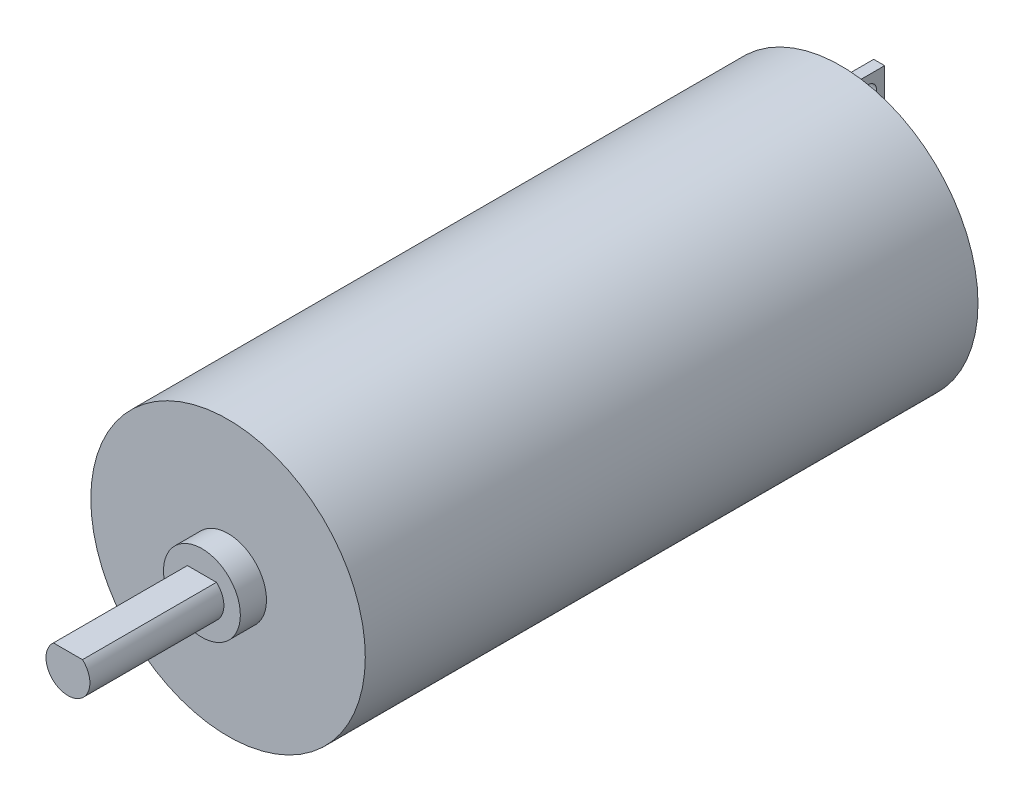
ISO-10303-21;
HEADER;
FILE_DESCRIPTION(('STEP AP214'),'2;1');
FILE_NAME('part.step','',(''),(''),'','','');
FILE_SCHEMA(('AUTOMOTIVE_DESIGN { 1 0 10303 214 1 1 1 1 }'));
ENDSEC;
DATA;
#1=APPLICATION_CONTEXT('core data for automotive mechanical design processes');
#2=APPLICATION_PROTOCOL_DEFINITION('international standard','automotive_design',2000,#1);
#3=PRODUCT_CONTEXT('',#1,'mechanical');
#4=PRODUCT('Part','Part','',(#3));
#5=PRODUCT_RELATED_PRODUCT_CATEGORY('part','',(#4));
#6=PRODUCT_DEFINITION_FORMATION('','',#4);
#7=PRODUCT_DEFINITION_CONTEXT('part definition',#1,'design');
#8=PRODUCT_DEFINITION('design','',#6,#7);
#9=PRODUCT_DEFINITION_SHAPE('','',#8);
#10=(LENGTH_UNIT() NAMED_UNIT(*) SI_UNIT(.MILLI.,.METRE.));
#11=(NAMED_UNIT(*) PLANE_ANGLE_UNIT() SI_UNIT($,.RADIAN.));
#12=(NAMED_UNIT(*) SI_UNIT($,.STERADIAN.) SOLID_ANGLE_UNIT());
#13=UNCERTAINTY_MEASURE_WITH_UNIT(LENGTH_MEASURE(1.E-05),#10,'distance_accuracy_value','');
#14=(GEOMETRIC_REPRESENTATION_CONTEXT(3) GLOBAL_UNCERTAINTY_ASSIGNED_CONTEXT((#13)) GLOBAL_UNIT_ASSIGNED_CONTEXT((#10,
#11,#12)) REPRESENTATION_CONTEXT('',''));
#15=CARTESIAN_POINT('',(0.,0.,0.));
#16=DIRECTION('',(0.,0.,1.));
#17=DIRECTION('',(1.,0.,0.));
#18=AXIS2_PLACEMENT_3D('',#15,#16,#17);
#19=CARTESIAN_POINT('',(0.,0.,70.38));
#20=DIRECTION('',(0.,0.,-1.));
#21=DIRECTION('',(-1.,0.,0.));
#22=AXIS2_PLACEMENT_3D('',#19,#20,#21);
#23=CYLINDRICAL_SURFACE('',#22,2.);
#24=DIRECTION('',(0.,0.,-1.));
#25=VECTOR('',#24,1.);
#26=CARTESIAN_POINT('',(-1.3228756555323,1.5,70.38));
#27=LINE('',#26,#25);
#28=CARTESIAN_POINT('',(-1.3228756555323,1.5,70.38));
#29=VERTEX_POINT('',#28);
#30=CARTESIAN_POINT('',(-1.3228756555323,1.5,58.18));
#31=VERTEX_POINT('',#30);
#32=EDGE_CURVE('E223',#29,#31,#27,.T.);
#33=ORIENTED_EDGE('',*,*,#32,.T.);
#34=CARTESIAN_POINT('',(0.,0.,58.18));
#35=DIRECTION('',(0.,0.,1.));
#36=DIRECTION('',(1.,0.,0.));
#37=AXIS2_PLACEMENT_3D('',#34,#35,#36);
#38=CIRCLE('',#37,2.);
#39=CARTESIAN_POINT('',(1.3228756555323,1.5,58.18));
#40=VERTEX_POINT('',#39);
#41=EDGE_CURVE('E11',#31,#40,#38,.T.);
#42=ORIENTED_EDGE('',*,*,#41,.T.);
#43=DIRECTION('',(0.,0.,-1.));
#44=VECTOR('',#43,1.);
#45=CARTESIAN_POINT('',(1.3228756555323,1.5,70.38));
#46=LINE('',#45,#44);
#47=CARTESIAN_POINT('',(1.3228756555323,1.5,70.38));
#48=VERTEX_POINT('',#47);
#49=EDGE_CURVE('E217',#48,#40,#46,.T.);
#50=ORIENTED_EDGE('',*,*,#49,.F.);
#51=CARTESIAN_POINT('',(0.,0.,70.38));
#52=DIRECTION('',(0.,0.,1.));
#53=DIRECTION('',(1.,0.,0.));
#54=AXIS2_PLACEMENT_3D('',#51,#52,#53);
#55=CIRCLE('',#54,2.);
#56=EDGE_CURVE('E227',#29,#48,#55,.T.);
#57=ORIENTED_EDGE('',*,*,#56,.F.);
#58=EDGE_LOOP('',(#33,#42,#50,#57));
#59=FACE_BOUND('',#58,.T.);
#60=ADVANCED_FACE('F44',(#59),#23,.T.);
#61=CARTESIAN_POINT('',(0.,0.,70.38));
#62=DIRECTION('',(0.,0.,1.));
#63=DIRECTION('',(1.,0.,0.));
#64=AXIS2_PLACEMENT_3D('',#61,#62,#63);
#65=PLANE('',#64);
#66=ORIENTED_EDGE('',*,*,#56,.T.);
#67=DIRECTION('',(1.,0.,0.));
#68=VECTOR('',#67,1.);
#69=CARTESIAN_POINT('',(-1.3228756555323,1.5,70.38));
#70=LINE('',#69,#68);
#71=EDGE_CURVE('E214',#29,#48,#70,.T.);
#72=ORIENTED_EDGE('',*,*,#71,.F.);
#73=EDGE_LOOP('',(#66,#72));
#74=FACE_BOUND('',#73,.T.);
#75=ADVANCED_FACE('F286',(#74),#65,.T.);
#76=CARTESIAN_POINT('',(0.,0.,55.8));
#77=DIRECTION('',(0.,0.,-1.));
#78=DIRECTION('',(-1.,0.,0.));
#79=AXIS2_PLACEMENT_3D('',#76,#77,#78);
#80=CYLINDRICAL_SURFACE('',#79,12.5);
#81=CARTESIAN_POINT('',(0.,0.,55.8));
#82=DIRECTION('',(0.,0.,1.));
#83=DIRECTION('',(1.,0.,0.));
#84=AXIS2_PLACEMENT_3D('',#81,#82,#83);
#85=CIRCLE('',#84,12.5);
#86=CARTESIAN_POINT('',(12.5,0.,55.8));
#87=VERTEX_POINT('',#86);
#88=EDGE_CURVE('E239',#87,#87,#85,.T.);
#89=ORIENTED_EDGE('',*,*,#88,.F.);
#90=EDGE_LOOP('',(#89));
#91=FACE_BOUND('',#90,.T.);
#92=CARTESIAN_POINT('',(0.,0.,0.));
#93=DIRECTION('',(0.,0.,1.));
#94=DIRECTION('',(1.,0.,0.));
#95=AXIS2_PLACEMENT_3D('',#92,#93,#94);
#96=CIRCLE('',#95,12.5);
#97=CARTESIAN_POINT('',(12.5,0.,0.));
#98=VERTEX_POINT('',#97);
#99=EDGE_CURVE('E235',#98,#98,#96,.T.);
#100=ORIENTED_EDGE('',*,*,#99,.T.);
#101=EDGE_LOOP('',(#100));
#102=FACE_BOUND('',#101,.T.);
#103=ADVANCED_FACE('F46',(#91,#102),#80,.T.);
#104=CARTESIAN_POINT('',(0.,0.,55.8));
#105=DIRECTION('',(0.,0.,1.));
#106=DIRECTION('',(1.,0.,0.));
#107=AXIS2_PLACEMENT_3D('',#104,#105,#106);
#108=PLANE('',#107);
#109=CARTESIAN_POINT('',(0.,0.,55.8));
#110=DIRECTION('',(0.,0.,1.));
#111=DIRECTION('',(1.,0.,0.));
#112=AXIS2_PLACEMENT_3D('',#109,#110,#111);
#113=CIRCLE('',#112,3.5);
#114=CARTESIAN_POINT('',(3.5,0.,55.8));
#115=VERTEX_POINT('',#114);
#116=EDGE_CURVE('E54',#115,#115,#113,.T.);
#117=ORIENTED_EDGE('',*,*,#116,.F.);
#118=EDGE_LOOP('',(#117));
#119=FACE_BOUND('',#118,.T.);
#120=ORIENTED_EDGE('',*,*,#88,.T.);
#121=EDGE_LOOP('',(#120));
#122=FACE_BOUND('',#121,.T.);
#123=ADVANCED_FACE('F305',(#119,#122),#108,.T.);
#124=CARTESIAN_POINT('',(0.,0.,0.));
#125=DIRECTION('',(0.,0.,1.));
#126=DIRECTION('',(1.,0.,0.));
#127=AXIS2_PLACEMENT_3D('',#124,#125,#126);
#128=PLANE('',#127);
#129=DIRECTION('',(-1.,0.,0.));
#130=VECTOR('',#129,1.);
#131=CARTESIAN_POINT('',(-0.5,-8.,0.));
#132=LINE('',#131,#130);
#133=CARTESIAN_POINT('',(0.5,-8.,0.));
#134=VERTEX_POINT('',#133);
#135=CARTESIAN_POINT('',(-0.5,-8.,0.));
#136=VERTEX_POINT('',#135);
#137=EDGE_CURVE('E128',#134,#136,#132,.T.);
#138=ORIENTED_EDGE('',*,*,#137,.T.);
#139=DIRECTION('',(0.,-1.,0.));
#140=VECTOR('',#139,1.);
#141=CARTESIAN_POINT('',(-0.5,-8.,0.));
#142=LINE('',#141,#140);
#143=CARTESIAN_POINT('',(-0.5,-11.,0.));
#144=VERTEX_POINT('',#143);
#145=EDGE_CURVE('E139',#136,#144,#142,.T.);
#146=ORIENTED_EDGE('',*,*,#145,.T.);
#147=DIRECTION('',(1.,0.,0.));
#148=VECTOR('',#147,1.);
#149=CARTESIAN_POINT('',(-0.5,-11.,0.));
#150=LINE('',#149,#148);
#151=CARTESIAN_POINT('',(0.5,-11.,0.));
#152=VERTEX_POINT('',#151);
#153=EDGE_CURVE('E147',#144,#152,#150,.T.);
#154=ORIENTED_EDGE('',*,*,#153,.T.);
#155=DIRECTION('',(0.,1.,0.));
#156=VECTOR('',#155,1.);
#157=CARTESIAN_POINT('',(0.5,-8.,0.));
#158=LINE('',#157,#156);
#159=EDGE_CURVE('E62',#152,#134,#158,.T.);
#160=ORIENTED_EDGE('',*,*,#159,.T.);
#161=EDGE_LOOP('',(#138,#146,#154,#160));
#162=FACE_BOUND('',#161,.T.);
#163=DIRECTION('',(-1.,0.,0.));
#164=VECTOR('',#163,1.);
#165=CARTESIAN_POINT('',(-0.5,11.,0.));
#166=LINE('',#165,#164);
#167=CARTESIAN_POINT('',(0.5,11.,0.));
#168=VERTEX_POINT('',#167);
#169=CARTESIAN_POINT('',(-0.5,11.,0.));
#170=VERTEX_POINT('',#169);
#171=EDGE_CURVE('E177',#168,#170,#166,.T.);
#172=ORIENTED_EDGE('',*,*,#171,.T.);
#173=DIRECTION('',(0.,-1.,0.));
#174=VECTOR('',#173,1.);
#175=CARTESIAN_POINT('',(-0.5,11.,0.));
#176=LINE('',#175,#174);
#177=CARTESIAN_POINT('',(-0.5,8.,0.));
#178=VERTEX_POINT('',#177);
#179=EDGE_CURVE('E146',#170,#178,#176,.T.);
#180=ORIENTED_EDGE('',*,*,#179,.T.);
#181=DIRECTION('',(1.,0.,0.));
#182=VECTOR('',#181,1.);
#183=CARTESIAN_POINT('',(-0.5,8.,0.));
#184=LINE('',#183,#182);
#185=CARTESIAN_POINT('',(0.5,8.,0.));
#186=VERTEX_POINT('',#185);
#187=EDGE_CURVE('E193',#178,#186,#184,.T.);
#188=ORIENTED_EDGE('',*,*,#187,.T.);
#189=DIRECTION('',(0.,1.,0.));
#190=VECTOR('',#189,1.);
#191=CARTESIAN_POINT('',(0.5,11.,0.));
#192=LINE('',#191,#190);
#193=EDGE_CURVE('E70',#186,#168,#192,.T.);
#194=ORIENTED_EDGE('',*,*,#193,.T.);
#195=EDGE_LOOP('',(#172,#180,#188,#194));
#196=FACE_BOUND('',#195,.T.);
#197=ORIENTED_EDGE('',*,*,#99,.F.);
#198=EDGE_LOOP('',(#197));
#199=FACE_BOUND('',#198,.T.);
#200=ADVANCED_FACE('F149',(#162,#196,#199),#128,.F.);
#201=CARTESIAN_POINT('',(0.,0.,58.18));
#202=DIRECTION('',(0.,0.,-1.));
#203=DIRECTION('',(-1.,0.,0.));
#204=AXIS2_PLACEMENT_3D('',#201,#202,#203);
#205=CYLINDRICAL_SURFACE('',#204,3.5);
#206=CARTESIAN_POINT('',(0.,0.,58.18));
#207=DIRECTION('',(0.,0.,1.));
#208=DIRECTION('',(1.,0.,0.));
#209=AXIS2_PLACEMENT_3D('',#206,#207,#208);
#210=CIRCLE('',#209,3.5);
#211=CARTESIAN_POINT('',(3.5,0.,58.18));
#212=VERTEX_POINT('',#211);
#213=EDGE_CURVE('E230',#212,#212,#210,.T.);
#214=ORIENTED_EDGE('',*,*,#213,.F.);
#215=EDGE_LOOP('',(#214));
#216=FACE_BOUND('',#215,.T.);
#217=ORIENTED_EDGE('',*,*,#116,.T.);
#218=EDGE_LOOP('',(#217));
#219=FACE_BOUND('',#218,.T.);
#220=ADVANCED_FACE('F300',(#216,#219),#205,.T.);
#221=CARTESIAN_POINT('',(0.,0.,58.18));
#222=DIRECTION('',(0.,0.,1.));
#223=DIRECTION('',(1.,0.,0.));
#224=AXIS2_PLACEMENT_3D('',#221,#222,#223);
#225=PLANE('',#224);
#226=DIRECTION('',(1.,0.,0.));
#227=VECTOR('',#226,1.);
#228=CARTESIAN_POINT('',(-1.3228756555323,1.5,58.18));
#229=LINE('',#228,#227);
#230=EDGE_CURVE('E205',#31,#40,#229,.T.);
#231=ORIENTED_EDGE('',*,*,#230,.T.);
#232=ORIENTED_EDGE('',*,*,#41,.F.);
#233=EDGE_LOOP('',(#231,#232));
#234=FACE_BOUND('',#233,.T.);
#235=ORIENTED_EDGE('',*,*,#213,.T.);
#236=EDGE_LOOP('',(#235));
#237=FACE_BOUND('',#236,.T.);
#238=ADVANCED_FACE('F296',(#234,#237),#225,.T.);
#239=CARTESIAN_POINT('',(-1.3228756555323,1.5,70.38));
#240=DIRECTION('',(0.,1.,0.));
#241=DIRECTION('',(0.,0.,1.));
#242=AXIS2_PLACEMENT_3D('',#239,#240,#241);
#243=PLANE('',#242);
#244=ORIENTED_EDGE('',*,*,#230,.F.);
#245=ORIENTED_EDGE('',*,*,#32,.F.);
#246=ORIENTED_EDGE('',*,*,#71,.T.);
#247=ORIENTED_EDGE('',*,*,#49,.T.);
#248=EDGE_LOOP('',(#244,#245,#246,#247));
#249=FACE_BOUND('',#248,.T.);
#250=ADVANCED_FACE('F299',(#249),#243,.T.);
#251=CARTESIAN_POINT('',(-0.5,11.,-3.5));
#252=DIRECTION('',(-1.,0.,0.));
#253=DIRECTION('',(0.,-1.,0.));
#254=AXIS2_PLACEMENT_3D('',#251,#252,#253);
#255=PLANE('',#254);
#256=CARTESIAN_POINT('',(-0.5,9.5,-2.));
#257=DIRECTION('',(-1.,0.,0.));
#258=DIRECTION('',(0.,-1.,0.));
#259=AXIS2_PLACEMENT_3D('',#256,#257,#258);
#260=CIRCLE('',#259,0.75);
#261=CARTESIAN_POINT('',(-0.5,8.75,-2.));
#262=VERTEX_POINT('',#261);
#263=EDGE_CURVE('E136',#262,#262,#260,.T.);
#264=ORIENTED_EDGE('',*,*,#263,.F.);
#265=EDGE_LOOP('',(#264));
#266=FACE_BOUND('',#265,.T.);
#267=ORIENTED_EDGE('',*,*,#179,.F.);
#268=DIRECTION('',(0.,0.,1.));
#269=VECTOR('',#268,1.);
#270=CARTESIAN_POINT('',(-0.5,11.,-3.5));
#271=LINE('',#270,#269);
#272=CARTESIAN_POINT('',(-0.5,11.,-3.5));
#273=VERTEX_POINT('',#272);
#274=EDGE_CURVE('E202',#273,#170,#271,.T.);
#275=ORIENTED_EDGE('',*,*,#274,.F.);
#276=DIRECTION('',(0.,-1.,0.));
#277=VECTOR('',#276,1.);
#278=CARTESIAN_POINT('',(-0.5,11.,-3.5));
#279=LINE('',#278,#277);
#280=CARTESIAN_POINT('',(-0.5,8.,-3.5));
#281=VERTEX_POINT('',#280);
#282=EDGE_CURVE('E172',#273,#281,#279,.T.);
#283=ORIENTED_EDGE('',*,*,#282,.T.);
#284=DIRECTION('',(0.,0.,1.));
#285=VECTOR('',#284,1.);
#286=CARTESIAN_POINT('',(-0.5,8.,-3.5));
#287=LINE('',#286,#285);
#288=EDGE_CURVE('E189',#281,#178,#287,.T.);
#289=ORIENTED_EDGE('',*,*,#288,.T.);
#290=EDGE_LOOP('',(#267,#275,#283,#289));
#291=FACE_BOUND('',#290,.T.);
#292=ADVANCED_FACE('F330',(#266,#291),#255,.T.);
#293=CARTESIAN_POINT('',(-0.5,11.,-3.5));
#294=DIRECTION('',(0.,1.,0.));
#295=DIRECTION('',(0.,0.,1.));
#296=AXIS2_PLACEMENT_3D('',#293,#294,#295);
#297=PLANE('',#296);
#298=ORIENTED_EDGE('',*,*,#171,.F.);
#299=DIRECTION('',(0.,0.,1.));
#300=VECTOR('',#299,1.);
#301=CARTESIAN_POINT('',(0.5,11.,-3.5));
#302=LINE('',#301,#300);
#303=CARTESIAN_POINT('',(0.5,11.,-3.5));
#304=VERTEX_POINT('',#303);
#305=EDGE_CURVE('E206',#304,#168,#302,.T.);
#306=ORIENTED_EDGE('',*,*,#305,.F.);
#307=DIRECTION('',(-1.,0.,0.));
#308=VECTOR('',#307,1.);
#309=CARTESIAN_POINT('',(-0.5,11.,-3.5));
#310=LINE('',#309,#308);
#311=EDGE_CURVE('E185',#304,#273,#310,.T.);
#312=ORIENTED_EDGE('',*,*,#311,.T.);
#313=ORIENTED_EDGE('',*,*,#274,.T.);
#314=EDGE_LOOP('',(#298,#306,#312,#313));
#315=FACE_BOUND('',#314,.T.);
#316=ADVANCED_FACE('F337',(#315),#297,.T.);
#317=CARTESIAN_POINT('',(0.5,11.,-3.5));
#318=DIRECTION('',(1.,0.,0.));
#319=DIRECTION('',(0.,1.,0.));
#320=AXIS2_PLACEMENT_3D('',#317,#318,#319);
#321=PLANE('',#320);
#322=CARTESIAN_POINT('',(0.5,9.5,-2.));
#323=DIRECTION('',(1.,0.,0.));
#324=DIRECTION('',(0.,1.,0.));
#325=AXIS2_PLACEMENT_3D('',#322,#323,#324);
#326=CIRCLE('',#325,0.75);
#327=CARTESIAN_POINT('',(0.5,10.25,-2.));
#328=VERTEX_POINT('',#327);
#329=EDGE_CURVE('E48',#328,#328,#326,.T.);
#330=ORIENTED_EDGE('',*,*,#329,.F.);
#331=EDGE_LOOP('',(#330));
#332=FACE_BOUND('',#331,.T.);
#333=ORIENTED_EDGE('',*,*,#193,.F.);
#334=DIRECTION('',(0.,0.,1.));
#335=VECTOR('',#334,1.);
#336=CARTESIAN_POINT('',(0.5,8.,-3.5));
#337=LINE('',#336,#335);
#338=CARTESIAN_POINT('',(0.5,8.,-3.5));
#339=VERTEX_POINT('',#338);
#340=EDGE_CURVE('E209',#339,#186,#337,.T.);
#341=ORIENTED_EDGE('',*,*,#340,.F.);
#342=DIRECTION('',(0.,1.,0.));
#343=VECTOR('',#342,1.);
#344=CARTESIAN_POINT('',(0.5,11.,-3.5));
#345=LINE('',#344,#343);
#346=EDGE_CURVE('E181',#339,#304,#345,.T.);
#347=ORIENTED_EDGE('',*,*,#346,.T.);
#348=ORIENTED_EDGE('',*,*,#305,.T.);
#349=EDGE_LOOP('',(#333,#341,#347,#348));
#350=FACE_BOUND('',#349,.T.);
#351=ADVANCED_FACE('F346',(#332,#350),#321,.T.);
#352=CARTESIAN_POINT('',(-0.5,8.,-3.5));
#353=DIRECTION('',(0.,-1.,0.));
#354=DIRECTION('',(0.,0.,-1.));
#355=AXIS2_PLACEMENT_3D('',#352,#353,#354);
#356=PLANE('',#355);
#357=ORIENTED_EDGE('',*,*,#187,.F.);
#358=ORIENTED_EDGE('',*,*,#288,.F.);
#359=DIRECTION('',(1.,0.,0.));
#360=VECTOR('',#359,1.);
#361=CARTESIAN_POINT('',(-0.5,8.,-3.5));
#362=LINE('',#361,#360);
#363=EDGE_CURVE('E176',#281,#339,#362,.T.);
#364=ORIENTED_EDGE('',*,*,#363,.T.);
#365=ORIENTED_EDGE('',*,*,#340,.T.);
#366=EDGE_LOOP('',(#357,#358,#364,#365));
#367=FACE_BOUND('',#366,.T.);
#368=ADVANCED_FACE('F354',(#367),#356,.T.);
#369=CARTESIAN_POINT('',(0.,0.,-3.5));
#370=DIRECTION('',(0.,0.,1.));
#371=DIRECTION('',(1.,0.,0.));
#372=AXIS2_PLACEMENT_3D('',#369,#370,#371);
#373=PLANE('',#372);
#374=ORIENTED_EDGE('',*,*,#282,.F.);
#375=ORIENTED_EDGE('',*,*,#311,.F.);
#376=ORIENTED_EDGE('',*,*,#346,.F.);
#377=ORIENTED_EDGE('',*,*,#363,.F.);
#378=EDGE_LOOP('',(#374,#375,#376,#377));
#379=FACE_BOUND('',#378,.T.);
#380=ADVANCED_FACE('F362',(#379),#373,.F.);
#381=CARTESIAN_POINT('',(-0.5,-8.,-3.5));
#382=DIRECTION('',(-1.,0.,0.));
#383=DIRECTION('',(0.,-1.,0.));
#384=AXIS2_PLACEMENT_3D('',#381,#382,#383);
#385=PLANE('',#384);
#386=CARTESIAN_POINT('',(-0.5,-9.5,-2.));
#387=DIRECTION('',(-1.,0.,0.));
#388=DIRECTION('',(0.,-1.,0.));
#389=AXIS2_PLACEMENT_3D('',#386,#387,#388);
#390=CIRCLE('',#389,0.75);
#391=CARTESIAN_POINT('',(-0.5,-10.25,-2.));
#392=VERTEX_POINT('',#391);
#393=EDGE_CURVE('E248',#392,#392,#390,.T.);
#394=ORIENTED_EDGE('',*,*,#393,.F.);
#395=EDGE_LOOP('',(#394));
#396=FACE_BOUND('',#395,.T.);
#397=ORIENTED_EDGE('',*,*,#145,.F.);
#398=DIRECTION('',(0.,0.,1.));
#399=VECTOR('',#398,1.);
#400=CARTESIAN_POINT('',(-0.5,-8.,-3.5));
#401=LINE('',#400,#399);
#402=CARTESIAN_POINT('',(-0.5,-8.,-3.5));
#403=VERTEX_POINT('',#402);
#404=EDGE_CURVE('E124',#403,#136,#401,.T.);
#405=ORIENTED_EDGE('',*,*,#404,.F.);
#406=DIRECTION('',(0.,-1.,0.));
#407=VECTOR('',#406,1.);
#408=CARTESIAN_POINT('',(-0.5,-8.,-3.5));
#409=LINE('',#408,#407);
#410=CARTESIAN_POINT('',(-0.5,-11.,-3.5));
#411=VERTEX_POINT('',#410);
#412=EDGE_CURVE('E152',#403,#411,#409,.T.);
#413=ORIENTED_EDGE('',*,*,#412,.T.);
#414=DIRECTION('',(0.,0.,1.));
#415=VECTOR('',#414,1.);
#416=CARTESIAN_POINT('',(-0.5,-11.,-3.5));
#417=LINE('',#416,#415);
#418=EDGE_CURVE('E141',#411,#144,#417,.T.);
#419=ORIENTED_EDGE('',*,*,#418,.T.);
#420=EDGE_LOOP('',(#397,#405,#413,#419));
#421=FACE_BOUND('',#420,.T.);
#422=ADVANCED_FACE('F140',(#396,#421),#385,.T.);
#423=CARTESIAN_POINT('',(-0.5,-8.,-3.5));
#424=DIRECTION('',(0.,1.,0.));
#425=DIRECTION('',(0.,0.,1.));
#426=AXIS2_PLACEMENT_3D('',#423,#424,#425);
#427=PLANE('',#426);
#428=ORIENTED_EDGE('',*,*,#137,.F.);
#429=DIRECTION('',(0.,0.,1.));
#430=VECTOR('',#429,1.);
#431=CARTESIAN_POINT('',(0.5,-8.,-3.5));
#432=LINE('',#431,#430);
#433=CARTESIAN_POINT('',(0.5,-8.,-3.5));
#434=VERTEX_POINT('',#433);
#435=EDGE_CURVE('E135',#434,#134,#432,.T.);
#436=ORIENTED_EDGE('',*,*,#435,.F.);
#437=DIRECTION('',(-1.,0.,0.));
#438=VECTOR('',#437,1.);
#439=CARTESIAN_POINT('',(-0.5,-8.,-3.5));
#440=LINE('',#439,#438);
#441=EDGE_CURVE('E130',#434,#403,#440,.T.);
#442=ORIENTED_EDGE('',*,*,#441,.T.);
#443=ORIENTED_EDGE('',*,*,#404,.T.);
#444=EDGE_LOOP('',(#428,#436,#442,#443));
#445=FACE_BOUND('',#444,.T.);
#446=ADVANCED_FACE('F126',(#445),#427,.T.);
#447=CARTESIAN_POINT('',(0.5,-8.,-3.5));
#448=DIRECTION('',(1.,0.,0.));
#449=DIRECTION('',(0.,1.,0.));
#450=AXIS2_PLACEMENT_3D('',#447,#448,#449);
#451=PLANE('',#450);
#452=CARTESIAN_POINT('',(0.5,-9.5,-2.));
#453=DIRECTION('',(1.,0.,0.));
#454=DIRECTION('',(0.,1.,0.));
#455=AXIS2_PLACEMENT_3D('',#452,#453,#454);
#456=CIRCLE('',#455,0.75);
#457=CARTESIAN_POINT('',(0.5,-8.75,-2.));
#458=VERTEX_POINT('',#457);
#459=EDGE_CURVE('E245',#458,#458,#456,.T.);
#460=ORIENTED_EDGE('',*,*,#459,.F.);
#461=EDGE_LOOP('',(#460));
#462=FACE_BOUND('',#461,.T.);
#463=ORIENTED_EDGE('',*,*,#159,.F.);
#464=DIRECTION('',(0.,0.,1.));
#465=VECTOR('',#464,1.);
#466=CARTESIAN_POINT('',(0.5,-11.,-3.5));
#467=LINE('',#466,#465);
#468=CARTESIAN_POINT('',(0.5,-11.,-3.5));
#469=VERTEX_POINT('',#468);
#470=EDGE_CURVE('E264',#469,#152,#467,.T.);
#471=ORIENTED_EDGE('',*,*,#470,.F.);
#472=DIRECTION('',(0.,1.,0.));
#473=VECTOR('',#472,1.);
#474=CARTESIAN_POINT('',(0.5,-8.,-3.5));
#475=LINE('',#474,#473);
#476=EDGE_CURVE('E165',#469,#434,#475,.T.);
#477=ORIENTED_EDGE('',*,*,#476,.T.);
#478=ORIENTED_EDGE('',*,*,#435,.T.);
#479=EDGE_LOOP('',(#463,#471,#477,#478));
#480=FACE_BOUND('',#479,.T.);
#481=ADVANCED_FACE('F267',(#462,#480),#451,.T.);
#482=CARTESIAN_POINT('',(-0.5,-11.,-3.5));
#483=DIRECTION('',(0.,-1.,0.));
#484=DIRECTION('',(0.,0.,-1.));
#485=AXIS2_PLACEMENT_3D('',#482,#483,#484);
#486=PLANE('',#485);
#487=ORIENTED_EDGE('',*,*,#153,.F.);
#488=ORIENTED_EDGE('',*,*,#418,.F.);
#489=DIRECTION('',(1.,0.,0.));
#490=VECTOR('',#489,1.);
#491=CARTESIAN_POINT('',(-0.5,-11.,-3.5));
#492=LINE('',#491,#490);
#493=EDGE_CURVE('E157',#411,#469,#492,.T.);
#494=ORIENTED_EDGE('',*,*,#493,.T.);
#495=ORIENTED_EDGE('',*,*,#470,.T.);
#496=EDGE_LOOP('',(#487,#488,#494,#495));
#497=FACE_BOUND('',#496,.T.);
#498=ADVANCED_FACE('F273',(#497),#486,.T.);
#499=CARTESIAN_POINT('',(0.,0.,-3.5));
#500=DIRECTION('',(0.,0.,1.));
#501=DIRECTION('',(1.,0.,0.));
#502=AXIS2_PLACEMENT_3D('',#499,#500,#501);
#503=PLANE('',#502);
#504=ORIENTED_EDGE('',*,*,#412,.F.);
#505=ORIENTED_EDGE('',*,*,#441,.F.);
#506=ORIENTED_EDGE('',*,*,#476,.F.);
#507=ORIENTED_EDGE('',*,*,#493,.F.);
#508=EDGE_LOOP('',(#504,#505,#506,#507));
#509=FACE_BOUND('',#508,.T.);
#510=ADVANCED_FACE('F271',(#509),#503,.F.);
#511=CARTESIAN_POINT('',(-12.5,-9.5,-2.));
#512=DIRECTION('',(1.,0.,0.));
#513=DIRECTION('',(0.,0.,-1.));
#514=AXIS2_PLACEMENT_3D('',#511,#512,#513);
#515=CYLINDRICAL_SURFACE('',#514,0.75);
#516=ORIENTED_EDGE('',*,*,#393,.T.);
#517=EDGE_LOOP('',(#516));
#518=FACE_BOUND('',#517,.T.);
#519=ORIENTED_EDGE('',*,*,#459,.T.);
#520=EDGE_LOOP('',(#519));
#521=FACE_BOUND('',#520,.T.);
#522=ADVANCED_FACE('F280',(#518,#521),#515,.F.);
#523=CARTESIAN_POINT('',(-12.5,9.5,-2.));
#524=DIRECTION('',(1.,0.,0.));
#525=DIRECTION('',(0.,0.,-1.));
#526=AXIS2_PLACEMENT_3D('',#523,#524,#525);
#527=CYLINDRICAL_SURFACE('',#526,0.75);
#528=ORIENTED_EDGE('',*,*,#263,.T.);
#529=EDGE_LOOP('',(#528));
#530=FACE_BOUND('',#529,.T.);
#531=ORIENTED_EDGE('',*,*,#329,.T.);
#532=EDGE_LOOP('',(#531));
#533=FACE_BOUND('',#532,.T.);
#534=ADVANCED_FACE('F397',(#530,#533),#527,.F.);
#535=CLOSED_SHELL('',(#60,#75,#103,#123,#200,#220,#238,#250,#292,#316,#351,#368,#380,#422,#446,
#481,#498,#510,#522,#534));
#536=MANIFOLD_SOLID_BREP('B2',#535);
#537=ADVANCED_BREP_SHAPE_REPRESENTATION('',(#18,#536),#14);
#538=SHAPE_DEFINITION_REPRESENTATION(#9,#537);
ENDSEC;
END-ISO-10303-21;
